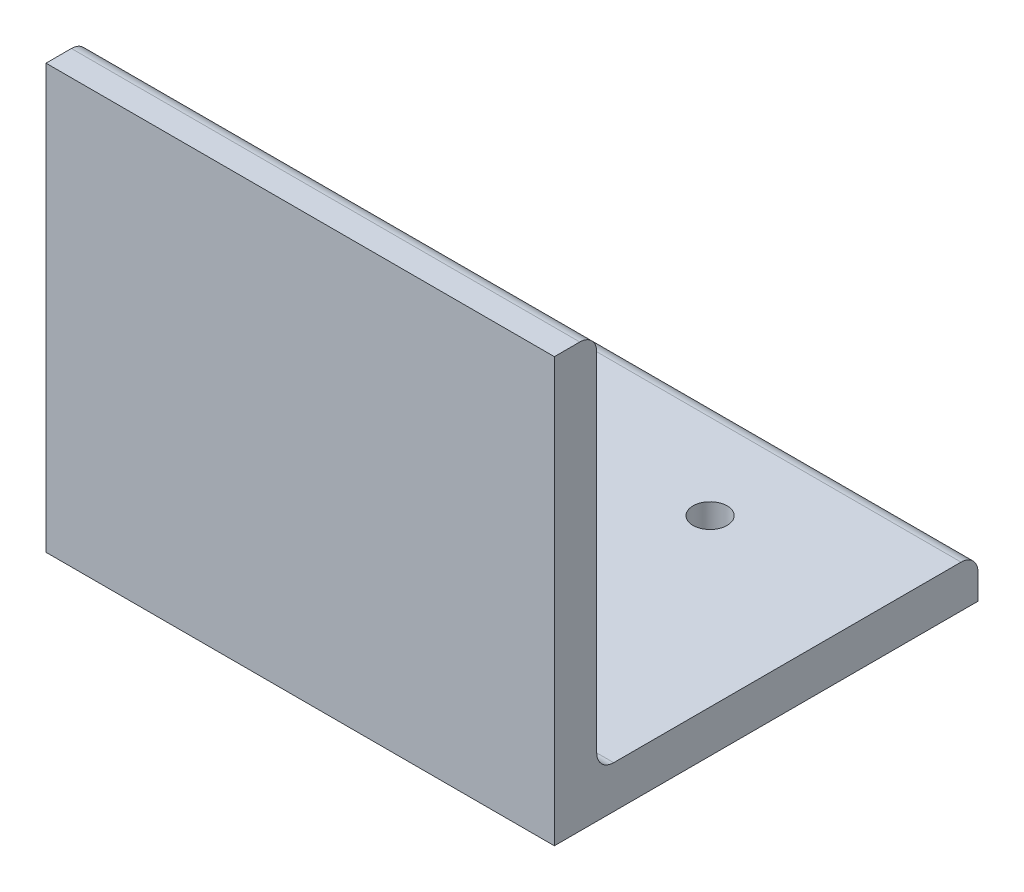
ISO-10303-21;
HEADER;
FILE_DESCRIPTION(('STEP AP214'),'2;1');
FILE_NAME('part.step','',(''),(''),'','','');
FILE_SCHEMA(('AUTOMOTIVE_DESIGN { 1 0 10303 214 1 1 1 1 }'));
ENDSEC;
DATA;
#1=APPLICATION_CONTEXT('core data for automotive mechanical design processes');
#2=APPLICATION_PROTOCOL_DEFINITION('international standard','automotive_design',2000,#1);
#3=PRODUCT_CONTEXT('',#1,'mechanical');
#4=PRODUCT('Part','Part','',(#3));
#5=PRODUCT_RELATED_PRODUCT_CATEGORY('part','',(#4));
#6=PRODUCT_DEFINITION_FORMATION('','',#4);
#7=PRODUCT_DEFINITION_CONTEXT('part definition',#1,'design');
#8=PRODUCT_DEFINITION('design','',#6,#7);
#9=PRODUCT_DEFINITION_SHAPE('','',#8);
#10=(LENGTH_UNIT() NAMED_UNIT(*) SI_UNIT(.MILLI.,.METRE.));
#11=(NAMED_UNIT(*) PLANE_ANGLE_UNIT() SI_UNIT($,.RADIAN.));
#12=(NAMED_UNIT(*) SI_UNIT($,.STERADIAN.) SOLID_ANGLE_UNIT());
#13=UNCERTAINTY_MEASURE_WITH_UNIT(LENGTH_MEASURE(1.E-05),#10,'distance_accuracy_value','');
#14=(GEOMETRIC_REPRESENTATION_CONTEXT(3) GLOBAL_UNCERTAINTY_ASSIGNED_CONTEXT((#13)) GLOBAL_UNIT_ASSIGNED_CONTEXT((#10,
#11,#12)) REPRESENTATION_CONTEXT('',''));
#15=CARTESIAN_POINT('',(0.,0.,0.));
#16=DIRECTION('',(0.,0.,1.));
#17=DIRECTION('',(1.,0.,0.));
#18=AXIS2_PLACEMENT_3D('',#15,#16,#17);
#19=CARTESIAN_POINT('',(76.2,0.,0.));
#20=DIRECTION('',(0.,1.,0.));
#21=DIRECTION('',(0.,0.,1.));
#22=AXIS2_PLACEMENT_3D('',#19,#20,#21);
#23=PLANE('',#22);
#24=CARTESIAN_POINT('',(24.8417478527522,0.,-48.1832521472478));
#25=DIRECTION('',(0.,-1.,0.));
#26=DIRECTION('',(0.,0.,-1.));
#27=AXIS2_PLACEMENT_3D('',#24,#25,#26);
#28=CIRCLE('',#27,4.8895);
#29=CARTESIAN_POINT('',(24.8417478527522,0.,-53.0727521472478));
#30=VERTEX_POINT('',#29);
#31=EDGE_CURVE('E241',#30,#30,#28,.T.);
#32=ORIENTED_EDGE('',*,*,#31,.F.);
#33=EDGE_LOOP('',(#32));
#34=FACE_BOUND('',#33,.T.);
#35=CARTESIAN_POINT('',(51.3582521472478,0.,-48.1832521472478));
#36=DIRECTION('',(0.,-1.,0.));
#37=DIRECTION('',(0.,0.,-1.));
#38=AXIS2_PLACEMENT_3D('',#35,#36,#37);
#39=CIRCLE('',#38,4.8895);
#40=CARTESIAN_POINT('',(51.3582521472478,0.,-53.0727521472478));
#41=VERTEX_POINT('',#40);
#42=EDGE_CURVE('E232',#41,#41,#39,.T.);
#43=ORIENTED_EDGE('',*,*,#42,.F.);
#44=EDGE_LOOP('',(#43));
#45=FACE_BOUND('',#44,.T.);
#46=CARTESIAN_POINT('',(51.3582521472478,0.,-21.6667478527522));
#47=DIRECTION('',(0.,-1.,0.));
#48=DIRECTION('',(0.,0.,-1.));
#49=AXIS2_PLACEMENT_3D('',#46,#47,#48);
#50=CIRCLE('',#49,4.8895);
#51=CARTESIAN_POINT('',(51.3582521472478,0.,-26.5562478527522));
#52=VERTEX_POINT('',#51);
#53=EDGE_CURVE('E223',#52,#52,#50,.T.);
#54=ORIENTED_EDGE('',*,*,#53,.F.);
#55=EDGE_LOOP('',(#54));
#56=FACE_BOUND('',#55,.T.);
#57=CARTESIAN_POINT('',(24.8417478527522,0.,-21.6667478527522));
#58=DIRECTION('',(0.,-1.,0.));
#59=DIRECTION('',(0.,0.,-1.));
#60=AXIS2_PLACEMENT_3D('',#57,#58,#59);
#61=CIRCLE('',#60,4.8895);
#62=CARTESIAN_POINT('',(24.8417478527522,0.,-26.5562478527522));
#63=VERTEX_POINT('',#62);
#64=EDGE_CURVE('E214',#63,#63,#61,.T.);
#65=ORIENTED_EDGE('',*,*,#64,.F.);
#66=EDGE_LOOP('',(#65));
#67=FACE_BOUND('',#66,.T.);
#68=DIRECTION('',(0.,0.,-1.));
#69=VECTOR('',#68,1.);
#70=CARTESIAN_POINT('',(0.,0.,0.));
#71=LINE('',#70,#69);
#72=CARTESIAN_POINT('',(0.,0.,0.));
#73=VERTEX_POINT('',#72);
#74=CARTESIAN_POINT('',(0.,0.,-63.5));
#75=VERTEX_POINT('',#74);
#76=EDGE_CURVE('E151',#73,#75,#71,.T.);
#77=ORIENTED_EDGE('',*,*,#76,.T.);
#78=DIRECTION('',(-1.,0.,0.));
#79=VECTOR('',#78,1.);
#80=CARTESIAN_POINT('',(76.2,0.,-63.5));
#81=LINE('',#80,#79);
#82=CARTESIAN_POINT('',(76.2,0.,-63.5));
#83=VERTEX_POINT('',#82);
#84=EDGE_CURVE('E13',#83,#75,#81,.T.);
#85=ORIENTED_EDGE('',*,*,#84,.F.);
#86=DIRECTION('',(0.,0.,-1.));
#87=VECTOR('',#86,1.);
#88=CARTESIAN_POINT('',(76.2,0.,0.));
#89=LINE('',#88,#87);
#90=CARTESIAN_POINT('',(76.2,0.,0.));
#91=VERTEX_POINT('',#90);
#92=EDGE_CURVE('E168',#91,#83,#89,.T.);
#93=ORIENTED_EDGE('',*,*,#92,.F.);
#94=DIRECTION('',(-1.,0.,0.));
#95=VECTOR('',#94,1.);
#96=CARTESIAN_POINT('',(76.2,0.,0.));
#97=LINE('',#96,#95);
#98=EDGE_CURVE('E147',#91,#73,#97,.T.);
#99=ORIENTED_EDGE('',*,*,#98,.T.);
#100=EDGE_LOOP('',(#77,#85,#93,#99));
#101=FACE_BOUND('',#100,.T.);
#102=ADVANCED_FACE('F49',(#34,#45,#56,#67,#101),#23,.F.);
#103=CARTESIAN_POINT('',(76.2,0.,-63.5));
#104=DIRECTION('',(0.,0.,1.));
#105=DIRECTION('',(1.,0.,0.));
#106=AXIS2_PLACEMENT_3D('',#103,#104,#105);
#107=PLANE('',#106);
#108=DIRECTION('',(0.,1.,0.));
#109=VECTOR('',#108,1.);
#110=CARTESIAN_POINT('',(0.,0.,-63.5));
#111=LINE('',#110,#109);
#112=CARTESIAN_POINT('',(0.,3.80999999999998,-63.5));
#113=VERTEX_POINT('',#112);
#114=EDGE_CURVE('E154',#75,#113,#111,.T.);
#115=ORIENTED_EDGE('',*,*,#114,.T.);
#116=DIRECTION('',(-1.,0.,0.));
#117=VECTOR('',#116,1.);
#118=CARTESIAN_POINT('',(76.2,3.80999999999998,-63.5));
#119=LINE('',#118,#117);
#120=CARTESIAN_POINT('',(76.2,3.80999999999998,-63.5));
#121=VERTEX_POINT('',#120);
#122=EDGE_CURVE('E57',#121,#113,#119,.T.);
#123=ORIENTED_EDGE('',*,*,#122,.F.);
#124=DIRECTION('',(0.,1.,0.));
#125=VECTOR('',#124,1.);
#126=CARTESIAN_POINT('',(76.2,0.,-63.5));
#127=LINE('',#126,#125);
#128=EDGE_CURVE('E111',#83,#121,#127,.T.);
#129=ORIENTED_EDGE('',*,*,#128,.F.);
#130=ORIENTED_EDGE('',*,*,#84,.T.);
#131=EDGE_LOOP('',(#115,#123,#129,#130));
#132=FACE_BOUND('',#131,.T.);
#133=ADVANCED_FACE('F249',(#132),#107,.F.);
#134=CARTESIAN_POINT('',(76.2,3.81,-60.96));
#135=DIRECTION('',(-1.,0.,0.));
#136=DIRECTION('',(0.,0.,1.));
#137=AXIS2_PLACEMENT_3D('',#134,#135,#136);
#138=CYLINDRICAL_SURFACE('',#137,2.54);
#139=CARTESIAN_POINT('',(0.,3.81,-60.96));
#140=DIRECTION('',(1.,0.,0.));
#141=DIRECTION('',(0.,0.,1.));
#142=AXIS2_PLACEMENT_3D('',#139,#140,#141);
#143=CIRCLE('',#142,2.54);
#144=CARTESIAN_POINT('',(0.,6.35,-60.96));
#145=VERTEX_POINT('',#144);
#146=EDGE_CURVE('E157',#113,#145,#143,.T.);
#147=ORIENTED_EDGE('',*,*,#146,.T.);
#148=DIRECTION('',(-1.,0.,0.));
#149=VECTOR('',#148,1.);
#150=CARTESIAN_POINT('',(76.2,6.35,-60.96));
#151=LINE('',#150,#149);
#152=CARTESIAN_POINT('',(76.2,6.35,-60.96));
#153=VERTEX_POINT('',#152);
#154=EDGE_CURVE('E178',#153,#145,#151,.T.);
#155=ORIENTED_EDGE('',*,*,#154,.F.);
#156=CARTESIAN_POINT('',(76.2,3.81,-60.96));
#157=DIRECTION('',(1.,0.,0.));
#158=DIRECTION('',(0.,0.,1.));
#159=AXIS2_PLACEMENT_3D('',#156,#157,#158);
#160=CIRCLE('',#159,2.54);
#161=EDGE_CURVE('E186',#121,#153,#160,.T.);
#162=ORIENTED_EDGE('',*,*,#161,.F.);
#163=ORIENTED_EDGE('',*,*,#122,.T.);
#164=EDGE_LOOP('',(#147,#155,#162,#163));
#165=FACE_BOUND('',#164,.T.);
#166=ADVANCED_FACE('F184',(#165),#138,.T.);
#167=CARTESIAN_POINT('',(76.2,6.35,-8.89000000000002));
#168=DIRECTION('',(0.,-1.,0.));
#169=DIRECTION('',(0.,0.,-1.));
#170=AXIS2_PLACEMENT_3D('',#167,#168,#169);
#171=PLANE('',#170);
#172=CARTESIAN_POINT('',(24.8417478527522,6.35,-48.1832521472478));
#173=DIRECTION('',(0.,-1.,0.));
#174=DIRECTION('',(0.,0.,-1.));
#175=AXIS2_PLACEMENT_3D('',#172,#173,#174);
#176=CIRCLE('',#175,2.5527);
#177=CARTESIAN_POINT('',(24.8417478527522,6.35,-50.7359521472478));
#178=VERTEX_POINT('',#177);
#179=EDGE_CURVE('E235',#178,#178,#176,.T.);
#180=ORIENTED_EDGE('',*,*,#179,.T.);
#181=EDGE_LOOP('',(#180));
#182=FACE_BOUND('',#181,.T.);
#183=CARTESIAN_POINT('',(51.3582521472478,6.35,-48.1832521472478));
#184=DIRECTION('',(0.,-1.,0.));
#185=DIRECTION('',(0.,0.,-1.));
#186=AXIS2_PLACEMENT_3D('',#183,#184,#185);
#187=CIRCLE('',#186,2.5527);
#188=CARTESIAN_POINT('',(51.3582521472478,6.35,-50.7359521472478));
#189=VERTEX_POINT('',#188);
#190=EDGE_CURVE('E226',#189,#189,#187,.T.);
#191=ORIENTED_EDGE('',*,*,#190,.T.);
#192=EDGE_LOOP('',(#191));
#193=FACE_BOUND('',#192,.T.);
#194=CARTESIAN_POINT('',(51.3582521472478,6.35,-21.6667478527522));
#195=DIRECTION('',(0.,-1.,0.));
#196=DIRECTION('',(0.,0.,-1.));
#197=AXIS2_PLACEMENT_3D('',#194,#195,#196);
#198=CIRCLE('',#197,2.5527);
#199=CARTESIAN_POINT('',(51.3582521472478,6.35,-24.2194478527522));
#200=VERTEX_POINT('',#199);
#201=EDGE_CURVE('E217',#200,#200,#198,.T.);
#202=ORIENTED_EDGE('',*,*,#201,.T.);
#203=EDGE_LOOP('',(#202));
#204=FACE_BOUND('',#203,.T.);
#205=CARTESIAN_POINT('',(24.8417478527522,6.35,-21.6667478527522));
#206=DIRECTION('',(0.,-1.,0.));
#207=DIRECTION('',(0.,0.,-1.));
#208=AXIS2_PLACEMENT_3D('',#205,#206,#207);
#209=CIRCLE('',#208,2.5527);
#210=CARTESIAN_POINT('',(24.8417478527522,6.35,-24.2194478527522));
#211=VERTEX_POINT('',#210);
#212=EDGE_CURVE('E155',#211,#211,#209,.T.);
#213=ORIENTED_EDGE('',*,*,#212,.T.);
#214=EDGE_LOOP('',(#213));
#215=FACE_BOUND('',#214,.T.);
#216=DIRECTION('',(0.,0.,1.));
#217=VECTOR('',#216,1.);
#218=CARTESIAN_POINT('',(0.,6.35,-8.89000000000002));
#219=LINE('',#218,#217);
#220=CARTESIAN_POINT('',(0.,6.35,-8.89000000000002));
#221=VERTEX_POINT('',#220);
#222=EDGE_CURVE('E159',#145,#221,#219,.T.);
#223=ORIENTED_EDGE('',*,*,#222,.T.);
#224=DIRECTION('',(-1.,0.,0.));
#225=VECTOR('',#224,1.);
#226=CARTESIAN_POINT('',(76.2,6.35,-8.89000000000002));
#227=LINE('',#226,#225);
#228=CARTESIAN_POINT('',(76.2,6.35,-8.89000000000002));
#229=VERTEX_POINT('',#228);
#230=EDGE_CURVE('E175',#229,#221,#227,.T.);
#231=ORIENTED_EDGE('',*,*,#230,.F.);
#232=DIRECTION('',(0.,0.,1.));
#233=VECTOR('',#232,1.);
#234=CARTESIAN_POINT('',(76.2,6.35,-8.89000000000002));
#235=LINE('',#234,#233);
#236=EDGE_CURVE('E202',#153,#229,#235,.T.);
#237=ORIENTED_EDGE('',*,*,#236,.F.);
#238=ORIENTED_EDGE('',*,*,#154,.T.);
#239=EDGE_LOOP('',(#223,#231,#237,#238));
#240=FACE_BOUND('',#239,.T.);
#241=ADVANCED_FACE('F195',(#182,#193,#204,#215,#240),#171,.F.);
#242=CARTESIAN_POINT('',(76.2,8.89,-8.89));
#243=DIRECTION('',(-1.,0.,0.));
#244=DIRECTION('',(0.,0.,1.));
#245=AXIS2_PLACEMENT_3D('',#242,#243,#244);
#246=CYLINDRICAL_SURFACE('',#245,2.54);
#247=CARTESIAN_POINT('',(0.,8.89,-8.89));
#248=DIRECTION('',(-1.,0.,0.));
#249=DIRECTION('',(0.,0.,1.));
#250=AXIS2_PLACEMENT_3D('',#247,#248,#249);
#251=CIRCLE('',#250,2.54);
#252=CARTESIAN_POINT('',(0.,8.89000000000002,-6.35));
#253=VERTEX_POINT('',#252);
#254=EDGE_CURVE('E161',#221,#253,#251,.T.);
#255=ORIENTED_EDGE('',*,*,#254,.T.);
#256=DIRECTION('',(-1.,0.,0.));
#257=VECTOR('',#256,1.);
#258=CARTESIAN_POINT('',(76.2,8.89000000000002,-6.35));
#259=LINE('',#258,#257);
#260=CARTESIAN_POINT('',(76.2,8.89000000000002,-6.35));
#261=VERTEX_POINT('',#260);
#262=EDGE_CURVE('E172',#261,#253,#259,.T.);
#263=ORIENTED_EDGE('',*,*,#262,.F.);
#264=CARTESIAN_POINT('',(76.2,8.89,-8.89));
#265=DIRECTION('',(-1.,0.,0.));
#266=DIRECTION('',(0.,0.,1.));
#267=AXIS2_PLACEMENT_3D('',#264,#265,#266);
#268=CIRCLE('',#267,2.54);
#269=EDGE_CURVE('E201',#229,#261,#268,.T.);
#270=ORIENTED_EDGE('',*,*,#269,.F.);
#271=ORIENTED_EDGE('',*,*,#230,.T.);
#272=EDGE_LOOP('',(#255,#263,#270,#271));
#273=FACE_BOUND('',#272,.T.);
#274=ADVANCED_FACE('F199',(#273),#246,.F.);
#275=CARTESIAN_POINT('',(76.2,8.89000000000002,-6.35));
#276=DIRECTION('',(0.,0.,1.));
#277=DIRECTION('',(1.,0.,0.));
#278=AXIS2_PLACEMENT_3D('',#275,#276,#277);
#279=PLANE('',#278);
#280=DIRECTION('',(0.,1.,0.));
#281=VECTOR('',#280,1.);
#282=CARTESIAN_POINT('',(0.,8.89000000000002,-6.35));
#283=LINE('',#282,#281);
#284=CARTESIAN_POINT('',(0.,60.96,-6.35));
#285=VERTEX_POINT('',#284);
#286=EDGE_CURVE('E163',#253,#285,#283,.T.);
#287=ORIENTED_EDGE('',*,*,#286,.T.);
#288=DIRECTION('',(-1.,0.,0.));
#289=VECTOR('',#288,1.);
#290=CARTESIAN_POINT('',(76.2,60.96,-6.35));
#291=LINE('',#290,#289);
#292=CARTESIAN_POINT('',(76.2,60.96,-6.35));
#293=VERTEX_POINT('',#292);
#294=EDGE_CURVE('E142',#293,#285,#291,.T.);
#295=ORIENTED_EDGE('',*,*,#294,.F.);
#296=DIRECTION('',(0.,1.,0.));
#297=VECTOR('',#296,1.);
#298=CARTESIAN_POINT('',(76.2,8.89000000000002,-6.35));
#299=LINE('',#298,#297);
#300=EDGE_CURVE('E133',#261,#293,#299,.T.);
#301=ORIENTED_EDGE('',*,*,#300,.F.);
#302=ORIENTED_EDGE('',*,*,#262,.T.);
#303=EDGE_LOOP('',(#287,#295,#301,#302));
#304=FACE_BOUND('',#303,.T.);
#305=ADVANCED_FACE('F259',(#304),#279,.F.);
#306=CARTESIAN_POINT('',(76.2,60.96,-3.81));
#307=DIRECTION('',(-1.,0.,0.));
#308=DIRECTION('',(0.,0.,1.));
#309=AXIS2_PLACEMENT_3D('',#306,#307,#308);
#310=CYLINDRICAL_SURFACE('',#309,2.54);
#311=CARTESIAN_POINT('',(0.,60.96,-3.81));
#312=DIRECTION('',(1.,0.,0.));
#313=DIRECTION('',(0.,0.,1.));
#314=AXIS2_PLACEMENT_3D('',#311,#312,#313);
#315=CIRCLE('',#314,2.54);
#316=CARTESIAN_POINT('',(0.,63.5,-3.80999999999998));
#317=VERTEX_POINT('',#316);
#318=EDGE_CURVE('E141',#285,#317,#315,.T.);
#319=ORIENTED_EDGE('',*,*,#318,.T.);
#320=DIRECTION('',(-1.,0.,0.));
#321=VECTOR('',#320,1.);
#322=CARTESIAN_POINT('',(76.2,63.5,-3.80999999999998));
#323=LINE('',#322,#321);
#324=CARTESIAN_POINT('',(76.2,63.5,-3.80999999999998));
#325=VERTEX_POINT('',#324);
#326=EDGE_CURVE('E138',#325,#317,#323,.T.);
#327=ORIENTED_EDGE('',*,*,#326,.F.);
#328=CARTESIAN_POINT('',(76.2,60.96,-3.81));
#329=DIRECTION('',(1.,0.,0.));
#330=DIRECTION('',(0.,0.,1.));
#331=AXIS2_PLACEMENT_3D('',#328,#329,#330);
#332=CIRCLE('',#331,2.54);
#333=EDGE_CURVE('E127',#293,#325,#332,.T.);
#334=ORIENTED_EDGE('',*,*,#333,.F.);
#335=ORIENTED_EDGE('',*,*,#294,.T.);
#336=EDGE_LOOP('',(#319,#327,#334,#335));
#337=FACE_BOUND('',#336,.T.);
#338=ADVANCED_FACE('F139',(#337),#310,.T.);
#339=CARTESIAN_POINT('',(76.2,63.5,0.));
#340=DIRECTION('',(0.,-1.,0.));
#341=DIRECTION('',(0.,0.,-1.));
#342=AXIS2_PLACEMENT_3D('',#339,#340,#341);
#343=PLANE('',#342);
#344=DIRECTION('',(0.,0.,1.));
#345=VECTOR('',#344,1.);
#346=CARTESIAN_POINT('',(0.,63.5,0.));
#347=LINE('',#346,#345);
#348=CARTESIAN_POINT('',(0.,63.5,0.));
#349=VERTEX_POINT('',#348);
#350=EDGE_CURVE('E97',#317,#349,#347,.T.);
#351=ORIENTED_EDGE('',*,*,#350,.T.);
#352=DIRECTION('',(-1.,0.,0.));
#353=VECTOR('',#352,1.);
#354=CARTESIAN_POINT('',(76.2,63.5,0.));
#355=LINE('',#354,#353);
#356=CARTESIAN_POINT('',(76.2,63.5,0.));
#357=VERTEX_POINT('',#356);
#358=EDGE_CURVE('E143',#357,#349,#355,.T.);
#359=ORIENTED_EDGE('',*,*,#358,.F.);
#360=DIRECTION('',(0.,0.,1.));
#361=VECTOR('',#360,1.);
#362=CARTESIAN_POINT('',(76.2,63.5,0.));
#363=LINE('',#362,#361);
#364=EDGE_CURVE('E131',#325,#357,#363,.T.);
#365=ORIENTED_EDGE('',*,*,#364,.F.);
#366=ORIENTED_EDGE('',*,*,#326,.T.);
#367=EDGE_LOOP('',(#351,#359,#365,#366));
#368=FACE_BOUND('',#367,.T.);
#369=ADVANCED_FACE('F145',(#368),#343,.F.);
#370=CARTESIAN_POINT('',(76.2,0.,0.));
#371=DIRECTION('',(0.,0.,-1.));
#372=DIRECTION('',(-1.,0.,0.));
#373=AXIS2_PLACEMENT_3D('',#370,#371,#372);
#374=PLANE('',#373);
#375=DIRECTION('',(0.,-1.,0.));
#376=VECTOR('',#375,1.);
#377=CARTESIAN_POINT('',(0.,0.,0.));
#378=LINE('',#377,#376);
#379=EDGE_CURVE('E103',#349,#73,#378,.T.);
#380=ORIENTED_EDGE('',*,*,#379,.T.);
#381=ORIENTED_EDGE('',*,*,#98,.F.);
#382=DIRECTION('',(0.,-1.,0.));
#383=VECTOR('',#382,1.);
#384=CARTESIAN_POINT('',(76.2,0.,0.));
#385=LINE('',#384,#383);
#386=EDGE_CURVE('E65',#357,#91,#385,.T.);
#387=ORIENTED_EDGE('',*,*,#386,.F.);
#388=ORIENTED_EDGE('',*,*,#358,.T.);
#389=EDGE_LOOP('',(#380,#381,#387,#388));
#390=FACE_BOUND('',#389,.T.);
#391=ADVANCED_FACE('F311',(#390),#374,.F.);
#392=CARTESIAN_POINT('',(76.2,3.81,-60.96));
#393=DIRECTION('',(-1.,0.,0.));
#394=DIRECTION('',(0.,0.,1.));
#395=AXIS2_PLACEMENT_3D('',#392,#393,#394);
#396=PLANE('',#395);
#397=ORIENTED_EDGE('',*,*,#92,.T.);
#398=ORIENTED_EDGE('',*,*,#128,.T.);
#399=ORIENTED_EDGE('',*,*,#161,.T.);
#400=ORIENTED_EDGE('',*,*,#236,.T.);
#401=ORIENTED_EDGE('',*,*,#269,.T.);
#402=ORIENTED_EDGE('',*,*,#300,.T.);
#403=ORIENTED_EDGE('',*,*,#333,.T.);
#404=ORIENTED_EDGE('',*,*,#364,.T.);
#405=ORIENTED_EDGE('',*,*,#386,.T.);
#406=EDGE_LOOP('',(#397,#398,#399,#400,#401,#402,#403,#404,#405));
#407=FACE_BOUND('',#406,.T.);
#408=ADVANCED_FACE('F129',(#407),#396,.F.);
#409=CARTESIAN_POINT('',(0.,3.81,-60.96));
#410=DIRECTION('',(-1.,0.,0.));
#411=DIRECTION('',(0.,0.,1.));
#412=AXIS2_PLACEMENT_3D('',#409,#410,#411);
#413=PLANE('',#412);
#414=ORIENTED_EDGE('',*,*,#76,.F.);
#415=ORIENTED_EDGE('',*,*,#379,.F.);
#416=ORIENTED_EDGE('',*,*,#350,.F.);
#417=ORIENTED_EDGE('',*,*,#318,.F.);
#418=ORIENTED_EDGE('',*,*,#286,.F.);
#419=ORIENTED_EDGE('',*,*,#254,.F.);
#420=ORIENTED_EDGE('',*,*,#222,.F.);
#421=ORIENTED_EDGE('',*,*,#146,.F.);
#422=ORIENTED_EDGE('',*,*,#114,.F.);
#423=EDGE_LOOP('',(#414,#415,#416,#417,#418,#419,#420,#421,#422));
#424=FACE_BOUND('',#423,.T.);
#425=ADVANCED_FACE('F190',(#424),#413,.T.);
#426=CARTESIAN_POINT('',(24.8417478527522,0.,-21.6667478527522));
#427=DIRECTION('',(0.,-1.,0.));
#428=DIRECTION('',(0.,0.,-1.));
#429=AXIS2_PLACEMENT_3D('',#426,#427,#428);
#430=CYLINDRICAL_SURFACE('',#429,2.5527);
#431=ORIENTED_EDGE('',*,*,#212,.F.);
#432=EDGE_LOOP('',(#431));
#433=FACE_BOUND('',#432,.T.);
#434=CARTESIAN_POINT('',(24.8417478527522,1.96080801813507,-21.6667478527522));
#435=DIRECTION('',(0.,-1.,0.));
#436=DIRECTION('',(0.,0.,-1.));
#437=AXIS2_PLACEMENT_3D('',#434,#435,#436);
#438=CIRCLE('',#437,2.5527);
#439=CARTESIAN_POINT('',(24.8417478527522,1.96080801813507,-24.2194478527522));
#440=VERTEX_POINT('',#439);
#441=EDGE_CURVE('E211',#440,#440,#438,.T.);
#442=ORIENTED_EDGE('',*,*,#441,.T.);
#443=EDGE_LOOP('',(#442));
#444=FACE_BOUND('',#443,.T.);
#445=ADVANCED_FACE('F334',(#433,#444),#430,.F.);
#446=CARTESIAN_POINT('',(24.8417478527522,0.,-21.6667478527522));
#447=DIRECTION('',(0.,-1.,0.));
#448=DIRECTION('',(0.,0.,-1.));
#449=AXIS2_PLACEMENT_3D('',#446,#447,#448);
#450=CONICAL_SURFACE('',#449,4.8895,0.872664625997164);
#451=ORIENTED_EDGE('',*,*,#441,.F.);
#452=EDGE_LOOP('',(#451));
#453=FACE_BOUND('',#452,.T.);
#454=ORIENTED_EDGE('',*,*,#64,.T.);
#455=EDGE_LOOP('',(#454));
#456=FACE_BOUND('',#455,.T.);
#457=ADVANCED_FACE('F353',(#453,#456),#450,.F.);
#458=CARTESIAN_POINT('',(51.3582521472478,0.,-21.6667478527522));
#459=DIRECTION('',(0.,-1.,0.));
#460=DIRECTION('',(0.,0.,-1.));
#461=AXIS2_PLACEMENT_3D('',#458,#459,#460);
#462=CYLINDRICAL_SURFACE('',#461,2.5527);
#463=ORIENTED_EDGE('',*,*,#201,.F.);
#464=EDGE_LOOP('',(#463));
#465=FACE_BOUND('',#464,.T.);
#466=CARTESIAN_POINT('',(51.3582521472478,1.96080801813507,-21.6667478527522));
#467=DIRECTION('',(0.,-1.,0.));
#468=DIRECTION('',(0.,0.,-1.));
#469=AXIS2_PLACEMENT_3D('',#466,#467,#468);
#470=CIRCLE('',#469,2.5527);
#471=CARTESIAN_POINT('',(51.3582521472478,1.96080801813507,-24.2194478527522));
#472=VERTEX_POINT('',#471);
#473=EDGE_CURVE('E220',#472,#472,#470,.T.);
#474=ORIENTED_EDGE('',*,*,#473,.T.);
#475=EDGE_LOOP('',(#474));
#476=FACE_BOUND('',#475,.T.);
#477=ADVANCED_FACE('F360',(#465,#476),#462,.F.);
#478=CARTESIAN_POINT('',(51.3582521472478,0.,-21.6667478527522));
#479=DIRECTION('',(0.,-1.,0.));
#480=DIRECTION('',(0.,0.,-1.));
#481=AXIS2_PLACEMENT_3D('',#478,#479,#480);
#482=CONICAL_SURFACE('',#481,4.8895,0.872664625997164);
#483=ORIENTED_EDGE('',*,*,#473,.F.);
#484=EDGE_LOOP('',(#483));
#485=FACE_BOUND('',#484,.T.);
#486=ORIENTED_EDGE('',*,*,#53,.T.);
#487=EDGE_LOOP('',(#486));
#488=FACE_BOUND('',#487,.T.);
#489=ADVANCED_FACE('F368',(#485,#488),#482,.F.);
#490=CARTESIAN_POINT('',(51.3582521472478,0.,-48.1832521472478));
#491=DIRECTION('',(0.,-1.,0.));
#492=DIRECTION('',(0.,0.,-1.));
#493=AXIS2_PLACEMENT_3D('',#490,#491,#492);
#494=CYLINDRICAL_SURFACE('',#493,2.5527);
#495=ORIENTED_EDGE('',*,*,#190,.F.);
#496=EDGE_LOOP('',(#495));
#497=FACE_BOUND('',#496,.T.);
#498=CARTESIAN_POINT('',(51.3582521472478,1.96080801813507,-48.1832521472478));
#499=DIRECTION('',(0.,-1.,0.));
#500=DIRECTION('',(0.,0.,-1.));
#501=AXIS2_PLACEMENT_3D('',#498,#499,#500);
#502=CIRCLE('',#501,2.5527);
#503=CARTESIAN_POINT('',(51.3582521472478,1.96080801813507,-50.7359521472478));
#504=VERTEX_POINT('',#503);
#505=EDGE_CURVE('E229',#504,#504,#502,.T.);
#506=ORIENTED_EDGE('',*,*,#505,.T.);
#507=EDGE_LOOP('',(#506));
#508=FACE_BOUND('',#507,.T.);
#509=ADVANCED_FACE('F376',(#497,#508),#494,.F.);
#510=CARTESIAN_POINT('',(51.3582521472478,0.,-48.1832521472478));
#511=DIRECTION('',(0.,-1.,0.));
#512=DIRECTION('',(0.,0.,-1.));
#513=AXIS2_PLACEMENT_3D('',#510,#511,#512);
#514=CONICAL_SURFACE('',#513,4.8895,0.872664625997164);
#515=ORIENTED_EDGE('',*,*,#505,.F.);
#516=EDGE_LOOP('',(#515));
#517=FACE_BOUND('',#516,.T.);
#518=ORIENTED_EDGE('',*,*,#42,.T.);
#519=EDGE_LOOP('',(#518));
#520=FACE_BOUND('',#519,.T.);
#521=ADVANCED_FACE('F384',(#517,#520),#514,.F.);
#522=CARTESIAN_POINT('',(24.8417478527522,0.,-48.1832521472478));
#523=DIRECTION('',(0.,-1.,0.));
#524=DIRECTION('',(0.,0.,-1.));
#525=AXIS2_PLACEMENT_3D('',#522,#523,#524);
#526=CYLINDRICAL_SURFACE('',#525,2.5527);
#527=ORIENTED_EDGE('',*,*,#179,.F.);
#528=EDGE_LOOP('',(#527));
#529=FACE_BOUND('',#528,.T.);
#530=CARTESIAN_POINT('',(24.8417478527522,1.96080801813507,-48.1832521472478));
#531=DIRECTION('',(0.,-1.,0.));
#532=DIRECTION('',(0.,0.,-1.));
#533=AXIS2_PLACEMENT_3D('',#530,#531,#532);
#534=CIRCLE('',#533,2.5527);
#535=CARTESIAN_POINT('',(24.8417478527522,1.96080801813507,-50.7359521472478));
#536=VERTEX_POINT('',#535);
#537=EDGE_CURVE('E238',#536,#536,#534,.T.);
#538=ORIENTED_EDGE('',*,*,#537,.T.);
#539=EDGE_LOOP('',(#538));
#540=FACE_BOUND('',#539,.T.);
#541=ADVANCED_FACE('F392',(#529,#540),#526,.F.);
#542=CARTESIAN_POINT('',(24.8417478527522,0.,-48.1832521472478));
#543=DIRECTION('',(0.,-1.,0.));
#544=DIRECTION('',(0.,0.,-1.));
#545=AXIS2_PLACEMENT_3D('',#542,#543,#544);
#546=CONICAL_SURFACE('',#545,4.8895,0.872664625997164);
#547=ORIENTED_EDGE('',*,*,#537,.F.);
#548=EDGE_LOOP('',(#547));
#549=FACE_BOUND('',#548,.T.);
#550=ORIENTED_EDGE('',*,*,#31,.T.);
#551=EDGE_LOOP('',(#550));
#552=FACE_BOUND('',#551,.T.);
#553=ADVANCED_FACE('F245',(#549,#552),#546,.F.);
#554=CLOSED_SHELL('',(#102,#133,#166,#241,#274,#305,#338,#369,#391,#408,#425,#445,#457,#477,
#489,#509,#521,#541,#553));
#555=MANIFOLD_SOLID_BREP('B2',#554);
#556=ADVANCED_BREP_SHAPE_REPRESENTATION('',(#18,#555),#14);
#557=SHAPE_DEFINITION_REPRESENTATION(#9,#556);
ENDSEC;
END-ISO-10303-21;
